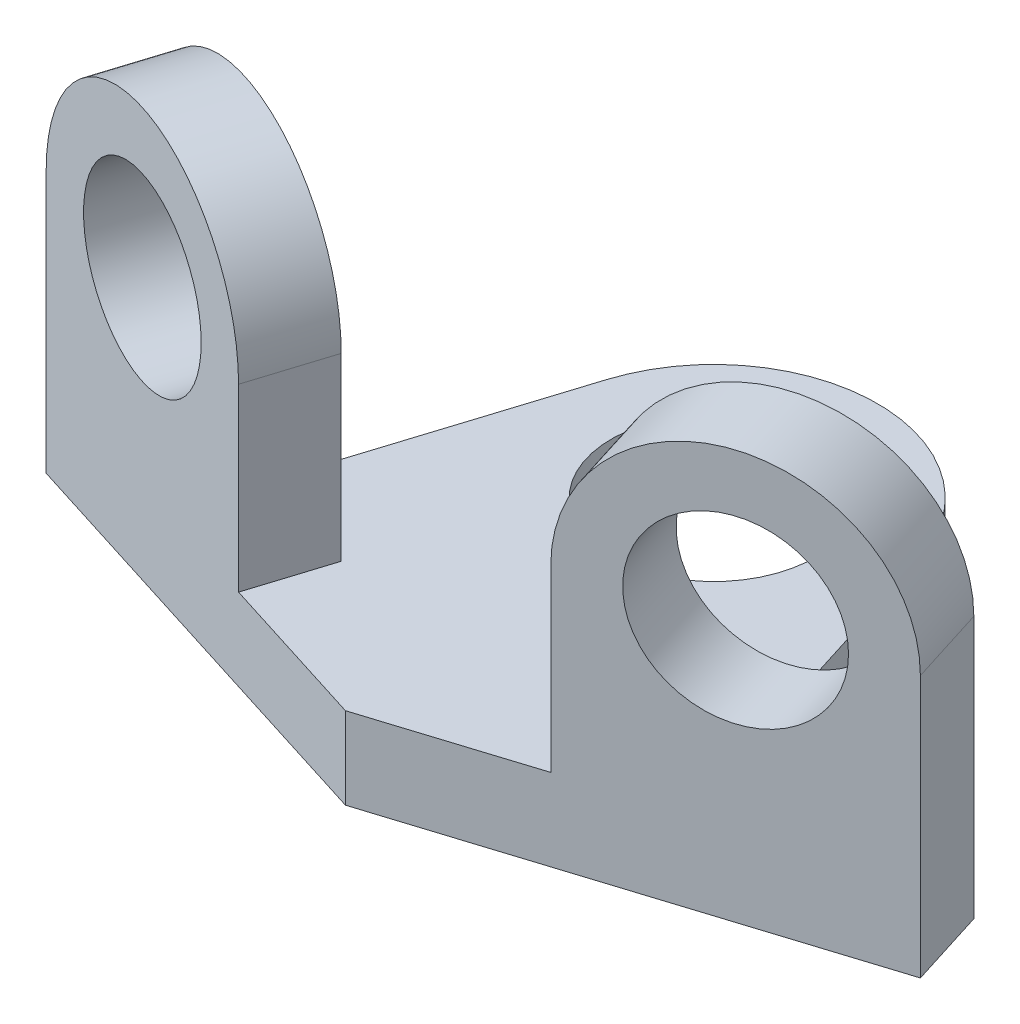
ISO-10303-21;
HEADER;
FILE_DESCRIPTION(('STEP AP214'),'2;1');
FILE_NAME('part.step','',(''),(''),'','','');
FILE_SCHEMA(('AUTOMOTIVE_DESIGN { 1 0 10303 214 1 1 1 1 }'));
ENDSEC;
DATA;
#1=APPLICATION_CONTEXT('core data for automotive mechanical design processes');
#2=APPLICATION_PROTOCOL_DEFINITION('international standard','automotive_design',2000,#1);
#3=PRODUCT_CONTEXT('',#1,'mechanical');
#4=PRODUCT('Part','Part','',(#3));
#5=PRODUCT_RELATED_PRODUCT_CATEGORY('part','',(#4));
#6=PRODUCT_DEFINITION_FORMATION('','',#4);
#7=PRODUCT_DEFINITION_CONTEXT('part definition',#1,'design');
#8=PRODUCT_DEFINITION('design','',#6,#7);
#9=PRODUCT_DEFINITION_SHAPE('','',#8);
#10=(LENGTH_UNIT() NAMED_UNIT(*) SI_UNIT(.MILLI.,.METRE.));
#11=(NAMED_UNIT(*) PLANE_ANGLE_UNIT() SI_UNIT($,.RADIAN.));
#12=(NAMED_UNIT(*) SI_UNIT($,.STERADIAN.) SOLID_ANGLE_UNIT());
#13=UNCERTAINTY_MEASURE_WITH_UNIT(LENGTH_MEASURE(1.E-05),#10,'distance_accuracy_value','');
#14=(GEOMETRIC_REPRESENTATION_CONTEXT(3) GLOBAL_UNCERTAINTY_ASSIGNED_CONTEXT((#13)) GLOBAL_UNIT_ASSIGNED_CONTEXT((#10,
#11,#12)) REPRESENTATION_CONTEXT('',''));
#15=CARTESIAN_POINT('',(0.,0.,0.));
#16=DIRECTION('',(0.,0.,1.));
#17=DIRECTION('',(1.,0.,0.));
#18=AXIS2_PLACEMENT_3D('',#15,#16,#17);
#19=CARTESIAN_POINT('',(0.,5.,-45.));
#20=DIRECTION('',(0.,1.,0.));
#21=DIRECTION('',(0.,0.,1.));
#22=AXIS2_PLACEMENT_3D('',#19,#20,#21);
#23=PLANE('',#22);
#24=DIRECTION('',(-0.953716950748228,0.,-0.30070579950427));
#25=VECTOR('',#24,1.);
#26=CARTESIAN_POINT('',(-9.89841182285572,5.,-13.6062485109799));
#27=LINE('',#26,#25);
#28=CARTESIAN_POINT('',(-16.0672810199219,5.,-15.5512854975677));
#29=VERTEX_POINT('',#28);
#30=CARTESIAN_POINT('',(-28.9727508378203,5.,-19.6203645010653));
#31=VERTEX_POINT('',#30);
#32=EDGE_CURVE('E63',#29,#31,#27,.T.);
#33=ORIENTED_EDGE('',*,*,#32,.F.);
#34=DIRECTION('',(-0.30070579950427,0.,0.953716950748228));
#35=VECTOR('',#34,1.);
#36=CARTESIAN_POINT('',(-6.16886919706614,5.,-46.9450369865878));
#37=LINE('',#36,#35);
#38=CARTESIAN_POINT('',(-19.0743390149646,5.,-6.0141159900854));
#39=VERTEX_POINT('',#38);
#40=EDGE_CURVE('E11',#29,#39,#37,.T.);
#41=ORIENTED_EDGE('',*,*,#40,.T.);
#42=DIRECTION('',(0.953716950748228,0.,0.30070579950427));
#43=VECTOR('',#42,1.);
#44=CARTESIAN_POINT('',(-31.979808832863,5.,-10.083194993583));
#45=LINE('',#44,#43);
#46=CARTESIAN_POINT('',(0.,5.,0.));
#47=VERTEX_POINT('',#46);
#48=EDGE_CURVE('E246',#39,#47,#45,.T.);
#49=ORIENTED_EDGE('',*,*,#48,.T.);
#50=DIRECTION('',(0.953716950748228,0.,-0.30070579950427));
#51=VECTOR('',#50,1.);
#52=CARTESIAN_POINT('',(0.,5.,0.));
#53=LINE('',#52,#51);
#54=CARTESIAN_POINT('',(19.0743390149646,5.,-6.0141159900854));
#55=VERTEX_POINT('',#54);
#56=EDGE_CURVE('E248',#47,#55,#53,.T.);
#57=ORIENTED_EDGE('',*,*,#56,.T.);
#58=DIRECTION('',(0.30070579950427,0.,0.953716950748228));
#59=VECTOR('',#58,1.);
#60=CARTESIAN_POINT('',(6.16886919706614,5.,-46.9450369865878));
#61=LINE('',#60,#59);
#62=CARTESIAN_POINT('',(16.0672810199219,5.,-15.5512854975677));
#63=VERTEX_POINT('',#62);
#64=EDGE_CURVE('E291',#63,#55,#61,.T.);
#65=ORIENTED_EDGE('',*,*,#64,.F.);
#66=DIRECTION('',(-0.953716950748228,0.,0.30070579950427));
#67=VECTOR('',#66,1.);
#68=CARTESIAN_POINT('',(9.89841182285572,5.,-13.6062485109799));
#69=LINE('',#68,#67);
#70=CARTESIAN_POINT('',(28.9727508378203,5.,-19.6203645010653));
#71=VERTEX_POINT('',#70);
#72=EDGE_CURVE('E227',#71,#63,#69,.T.);
#73=ORIENTED_EDGE('',*,*,#72,.F.);
#74=DIRECTION('',(-0.30070579950427,0.,-0.953716950748228));
#75=VECTOR('',#74,1.);
#76=CARTESIAN_POINT('',(31.979808832863,5.,-10.083194993583));
#77=LINE('',#76,#75);
#78=CARTESIAN_POINT('',(19.0743390149646,5.,-51.0141159900854));
#79=VERTEX_POINT('',#78);
#80=EDGE_CURVE('E255',#71,#79,#77,.T.);
#81=ORIENTED_EDGE('',*,*,#80,.T.);
#82=CARTESIAN_POINT('',(0.,5.,-45.));
#83=DIRECTION('',(0.,1.,0.));
#84=DIRECTION('',(0.,0.,1.));
#85=AXIS2_PLACEMENT_3D('',#82,#83,#84);
#86=CIRCLE('',#85,20.);
#87=CARTESIAN_POINT('',(-19.0743390149646,5.,-51.0141159900854));
#88=VERTEX_POINT('',#87);
#89=EDGE_CURVE('E260',#79,#88,#86,.T.);
#90=ORIENTED_EDGE('',*,*,#89,.T.);
#91=DIRECTION('',(-0.30070579950427,0.,0.953716950748228));
#92=VECTOR('',#91,1.);
#93=CARTESIAN_POINT('',(-19.0743390149646,5.,-51.0141159900854));
#94=LINE('',#93,#92);
#95=EDGE_CURVE('E257',#88,#31,#94,.T.);
#96=ORIENTED_EDGE('',*,*,#95,.T.);
#97=EDGE_LOOP('',(#33,#41,#49,#57,#65,#73,#81,#90,#96));
#98=FACE_BOUND('',#97,.T.);
#99=CARTESIAN_POINT('',(0.,5.,-45.));
#100=DIRECTION('',(0.,1.,0.));
#101=DIRECTION('',(0.,0.,1.));
#102=AXIS2_PLACEMENT_3D('',#99,#100,#101);
#103=CIRCLE('',#102,12.5);
#104=CARTESIAN_POINT('',(0.,5.,-32.5));
#105=VERTEX_POINT('',#104);
#106=EDGE_CURVE('E236',#105,#105,#103,.T.);
#107=ORIENTED_EDGE('',*,*,#106,.F.);
#108=EDGE_LOOP('',(#107));
#109=FACE_BOUND('',#108,.T.);
#110=ADVANCED_FACE('F44',(#98,#109),#23,.T.);
#111=CARTESIAN_POINT('',(0.,-5.,-45.));
#112=DIRECTION('',(0.,1.,0.));
#113=DIRECTION('',(0.,0.,1.));
#114=AXIS2_PLACEMENT_3D('',#111,#112,#113);
#115=PLANE('',#114);
#116=DIRECTION('',(0.953716950748228,0.,0.30070579950427));
#117=VECTOR('',#116,1.);
#118=CARTESIAN_POINT('',(-31.979808832863,-5.,-10.083194993583));
#119=LINE('',#118,#117);
#120=CARTESIAN_POINT('',(-53.4081492419008,-5.,-16.8395247722391));
#121=VERTEX_POINT('',#120);
#122=CARTESIAN_POINT('',(0.,-5.,0.));
#123=VERTEX_POINT('',#122);
#124=EDGE_CURVE('E244',#121,#123,#119,.T.);
#125=ORIENTED_EDGE('',*,*,#124,.F.);
#126=DIRECTION('',(-0.30070579950427,0.,0.953716950748228));
#127=VECTOR('',#126,1.);
#128=CARTESIAN_POINT('',(-50.4010912468581,-5.,-26.3766942797214));
#129=LINE('',#128,#127);
#130=CARTESIAN_POINT('',(-50.4010912468581,-5.,-26.3766942797214));
#131=VERTEX_POINT('',#130);
#132=EDGE_CURVE('E185',#131,#121,#129,.T.);
#133=ORIENTED_EDGE('',*,*,#132,.F.);
#134=DIRECTION('',(-0.953716950748228,0.,-0.30070579950427));
#135=VECTOR('',#134,1.);
#136=CARTESIAN_POINT('',(-50.4010912468581,-5.,-26.3766942797214));
#137=LINE('',#136,#135);
#138=CARTESIAN_POINT('',(-28.9727508378203,-5.,-19.6203645010653));
#139=VERTEX_POINT('',#138);
#140=EDGE_CURVE('E164',#139,#131,#137,.T.);
#141=ORIENTED_EDGE('',*,*,#140,.F.);
#142=DIRECTION('',(-0.30070579950427,0.,0.953716950748228));
#143=VECTOR('',#142,1.);
#144=CARTESIAN_POINT('',(-19.0743390149646,-5.,-51.0141159900854));
#145=LINE('',#144,#143);
#146=CARTESIAN_POINT('',(-19.0743390149646,-5.,-51.0141159900854));
#147=VERTEX_POINT('',#146);
#148=EDGE_CURVE('E250',#147,#139,#145,.T.);
#149=ORIENTED_EDGE('',*,*,#148,.F.);
#150=CARTESIAN_POINT('',(0.,-5.,-45.));
#151=DIRECTION('',(0.,1.,0.));
#152=DIRECTION('',(0.,0.,1.));
#153=AXIS2_PLACEMENT_3D('',#150,#151,#152);
#154=CIRCLE('',#153,20.);
#155=CARTESIAN_POINT('',(19.0743390149646,-5.,-51.0141159900854));
#156=VERTEX_POINT('',#155);
#157=EDGE_CURVE('E272',#156,#147,#154,.T.);
#158=ORIENTED_EDGE('',*,*,#157,.F.);
#159=DIRECTION('',(-0.30070579950427,0.,-0.953716950748228));
#160=VECTOR('',#159,1.);
#161=CARTESIAN_POINT('',(31.979808832863,-5.,-10.083194993583));
#162=LINE('',#161,#160);
#163=CARTESIAN_POINT('',(28.9727508378203,-5.,-19.6203645010653));
#164=VERTEX_POINT('',#163);
#165=EDGE_CURVE('E269',#164,#156,#162,.T.);
#166=ORIENTED_EDGE('',*,*,#165,.F.);
#167=DIRECTION('',(0.953716950748228,0.,-0.30070579950427));
#168=VECTOR('',#167,1.);
#169=CARTESIAN_POINT('',(50.4010912468581,-5.,-26.3766942797214));
#170=LINE('',#169,#168);
#171=CARTESIAN_POINT('',(50.4010912468581,-5.,-26.3766942797214));
#172=VERTEX_POINT('',#171);
#173=EDGE_CURVE('E68',#164,#172,#170,.T.);
#174=ORIENTED_EDGE('',*,*,#173,.T.);
#175=DIRECTION('',(0.30070579950427,0.,0.953716950748228));
#176=VECTOR('',#175,1.);
#177=CARTESIAN_POINT('',(50.4010912468581,-5.,-26.3766942797214));
#178=LINE('',#177,#176);
#179=CARTESIAN_POINT('',(53.4081492419008,-5.,-16.8395247722391));
#180=VERTEX_POINT('',#179);
#181=EDGE_CURVE('E212',#172,#180,#178,.T.);
#182=ORIENTED_EDGE('',*,*,#181,.T.);
#183=DIRECTION('',(0.953716950748228,0.,-0.30070579950427));
#184=VECTOR('',#183,1.);
#185=CARTESIAN_POINT('',(0.,-5.,0.));
#186=LINE('',#185,#184);
#187=EDGE_CURVE('E270',#123,#180,#186,.T.);
#188=ORIENTED_EDGE('',*,*,#187,.F.);
#189=EDGE_LOOP('',(#125,#133,#141,#149,#158,#166,#174,#182,#188));
#190=FACE_BOUND('',#189,.T.);
#191=CARTESIAN_POINT('',(0.,-5.,-45.));
#192=DIRECTION('',(0.,1.,0.));
#193=DIRECTION('',(0.,0.,1.));
#194=AXIS2_PLACEMENT_3D('',#191,#192,#193);
#195=CIRCLE('',#194,12.5);
#196=CARTESIAN_POINT('',(0.,-5.,-32.5));
#197=VERTEX_POINT('',#196);
#198=EDGE_CURVE('E240',#197,#197,#195,.T.);
#199=ORIENTED_EDGE('',*,*,#198,.T.);
#200=EDGE_LOOP('',(#199));
#201=FACE_BOUND('',#200,.T.);
#202=ADVANCED_FACE('F315',(#190,#201),#115,.F.);
#203=CARTESIAN_POINT('',(-31.979808832863,5.,-10.083194993583));
#204=DIRECTION('',(0.30070579950427,0.,-0.953716950748228));
#205=DIRECTION('',(-0.953716950748228,0.,-0.30070579950427));
#206=AXIS2_PLACEMENT_3D('',#203,#204,#205);
#207=PLANE('',#206);
#208=ORIENTED_EDGE('',*,*,#48,.F.);
#209=DIRECTION('',(0.,-1.,0.));
#210=VECTOR('',#209,1.);
#211=CARTESIAN_POINT('',(-19.0743390149646,-5.,-6.0141159900854));
#212=LINE('',#211,#210);
#213=CARTESIAN_POINT('',(-19.0743390149646,27.,-6.0141159900854));
#214=VERTEX_POINT('',#213);
#215=EDGE_CURVE('E175',#214,#39,#212,.T.);
#216=ORIENTED_EDGE('',*,*,#215,.F.);
#217=CARTESIAN_POINT('',(-36.2412441284327,27.,-11.4268203811623));
#218=DIRECTION('',(0.30070579950427,0.,-0.953716950748228));
#219=DIRECTION('',(0.953716950748228,0.,0.30070579950427));
#220=AXIS2_PLACEMENT_3D('',#217,#218,#219);
#221=CIRCLE('',#220,18.);
#222=CARTESIAN_POINT('',(-53.4081492419008,27.,-16.8395247722391));
#223=VERTEX_POINT('',#222);
#224=EDGE_CURVE('E160',#223,#214,#221,.T.);
#225=ORIENTED_EDGE('',*,*,#224,.F.);
#226=DIRECTION('',(0.,1.,0.));
#227=VECTOR('',#226,1.);
#228=CARTESIAN_POINT('',(-53.4081492419008,27.,-16.8395247722391));
#229=LINE('',#228,#227);
#230=EDGE_CURVE('E169',#121,#223,#229,.T.);
#231=ORIENTED_EDGE('',*,*,#230,.F.);
#232=ORIENTED_EDGE('',*,*,#124,.T.);
#233=DIRECTION('',(0.,-1.,0.));
#234=VECTOR('',#233,1.);
#235=CARTESIAN_POINT('',(0.,5.,0.));
#236=LINE('',#235,#234);
#237=EDGE_CURVE('E286',#47,#123,#236,.T.);
#238=ORIENTED_EDGE('',*,*,#237,.F.);
#239=EDGE_LOOP('',(#208,#216,#225,#231,#232,#238));
#240=FACE_BOUND('',#239,.T.);
#241=CARTESIAN_POINT('',(-36.2412441284327,27.,-11.4268203811623));
#242=DIRECTION('',(0.30070579950427,0.,-0.953716950748228));
#243=DIRECTION('',(-0.953716950748228,0.,-0.30070579950427));
#244=AXIS2_PLACEMENT_3D('',#241,#242,#243);
#245=CIRCLE('',#244,11.);
#246=CARTESIAN_POINT('',(-25.7503576702022,27.,-8.11905658661529));
#247=VERTEX_POINT('',#246);
#248=EDGE_CURVE('E511',#247,#247,#245,.T.);
#249=ORIENTED_EDGE('',*,*,#248,.T.);
#250=EDGE_LOOP('',(#249));
#251=FACE_BOUND('',#250,.T.);
#252=ADVANCED_FACE('F50',(#240,#251),#207,.F.);
#253=CARTESIAN_POINT('',(0.,5.,0.));
#254=DIRECTION('',(-0.30070579950427,0.,-0.953716950748228));
#255=DIRECTION('',(-0.953716950748228,0.,0.30070579950427));
#256=AXIS2_PLACEMENT_3D('',#253,#254,#255);
#257=PLANE('',#256);
#258=ORIENTED_EDGE('',*,*,#187,.T.);
#259=DIRECTION('',(0.,1.,0.));
#260=VECTOR('',#259,1.);
#261=CARTESIAN_POINT('',(53.4081492419008,27.,-16.8395247722391));
#262=LINE('',#261,#260);
#263=CARTESIAN_POINT('',(53.4081492419008,27.,-16.8395247722391));
#264=VERTEX_POINT('',#263);
#265=EDGE_CURVE('E195',#180,#264,#262,.T.);
#266=ORIENTED_EDGE('',*,*,#265,.T.);
#267=CARTESIAN_POINT('',(36.2412441284327,27.,-11.4268203811623));
#268=DIRECTION('',(0.30070579950427,0.,0.953716950748228));
#269=DIRECTION('',(-0.953716950748228,0.,0.30070579950427));
#270=AXIS2_PLACEMENT_3D('',#267,#268,#269);
#271=CIRCLE('',#270,18.);
#272=CARTESIAN_POINT('',(19.0743390149646,27.,-6.0141159900854));
#273=VERTEX_POINT('',#272);
#274=EDGE_CURVE('E217',#264,#273,#271,.T.);
#275=ORIENTED_EDGE('',*,*,#274,.T.);
#276=DIRECTION('',(0.,-1.,0.));
#277=VECTOR('',#276,1.);
#278=CARTESIAN_POINT('',(19.0743390149646,-5.,-6.0141159900854));
#279=LINE('',#278,#277);
#280=EDGE_CURVE('E205',#273,#55,#279,.T.);
#281=ORIENTED_EDGE('',*,*,#280,.T.);
#282=ORIENTED_EDGE('',*,*,#56,.F.);
#283=ORIENTED_EDGE('',*,*,#237,.T.);
#284=EDGE_LOOP('',(#258,#266,#275,#281,#282,#283));
#285=FACE_BOUND('',#284,.T.);
#286=CARTESIAN_POINT('',(36.2412441284327,27.,-11.4268203811623));
#287=DIRECTION('',(0.30070579950427,0.,0.953716950748228));
#288=DIRECTION('',(0.953716950748228,0.,-0.30070579950427));
#289=AXIS2_PLACEMENT_3D('',#286,#287,#288);
#290=CIRCLE('',#289,11.);
#291=CARTESIAN_POINT('',(46.7321305866632,27.,-14.7345841757092));
#292=VERTEX_POINT('',#291);
#293=EDGE_CURVE('E186',#292,#292,#290,.T.);
#294=ORIENTED_EDGE('',*,*,#293,.F.);
#295=EDGE_LOOP('',(#294));
#296=FACE_BOUND('',#295,.T.);
#297=ADVANCED_FACE('F326',(#285,#296),#257,.F.);
#298=CARTESIAN_POINT('',(31.979808832863,5.,-10.083194993583));
#299=DIRECTION('',(-0.953716950748228,0.,0.30070579950427));
#300=DIRECTION('',(0.30070579950427,0.,0.953716950748228));
#301=AXIS2_PLACEMENT_3D('',#298,#299,#300);
#302=PLANE('',#301);
#303=ORIENTED_EDGE('',*,*,#80,.F.);
#304=DIRECTION('',(0.,-1.,0.));
#305=VECTOR('',#304,1.);
#306=CARTESIAN_POINT('',(28.9727508378203,5.,-19.6203645010653));
#307=LINE('',#306,#305);
#308=EDGE_CURVE('E290',#71,#164,#307,.T.);
#309=ORIENTED_EDGE('',*,*,#308,.T.);
#310=ORIENTED_EDGE('',*,*,#165,.T.);
#311=DIRECTION('',(0.,-1.,0.));
#312=VECTOR('',#311,1.);
#313=CARTESIAN_POINT('',(19.0743390149646,5.,-51.0141159900854));
#314=LINE('',#313,#312);
#315=EDGE_CURVE('E284',#79,#156,#314,.T.);
#316=ORIENTED_EDGE('',*,*,#315,.F.);
#317=EDGE_LOOP('',(#303,#309,#310,#316));
#318=FACE_BOUND('',#317,.T.);
#319=ADVANCED_FACE('F342',(#318),#302,.F.);
#320=CARTESIAN_POINT('',(0.,5.,-45.));
#321=DIRECTION('',(0.,-1.,0.));
#322=DIRECTION('',(0.,0.,-1.));
#323=AXIS2_PLACEMENT_3D('',#320,#321,#322);
#324=CYLINDRICAL_SURFACE('',#323,20.);
#325=ORIENTED_EDGE('',*,*,#157,.T.);
#326=DIRECTION('',(0.,-1.,0.));
#327=VECTOR('',#326,1.);
#328=CARTESIAN_POINT('',(-19.0743390149646,5.,-51.0141159900854));
#329=LINE('',#328,#327);
#330=EDGE_CURVE('E262',#88,#147,#329,.T.);
#331=ORIENTED_EDGE('',*,*,#330,.F.);
#332=ORIENTED_EDGE('',*,*,#89,.F.);
#333=ORIENTED_EDGE('',*,*,#315,.T.);
#334=EDGE_LOOP('',(#325,#331,#332,#333));
#335=FACE_BOUND('',#334,.T.);
#336=ADVANCED_FACE('F310',(#335),#324,.T.);
#337=CARTESIAN_POINT('',(-19.0743390149646,5.,-51.0141159900854));
#338=DIRECTION('',(0.953716950748228,0.,0.30070579950427));
#339=DIRECTION('',(0.30070579950427,0.,-0.953716950748228));
#340=AXIS2_PLACEMENT_3D('',#337,#338,#339);
#341=PLANE('',#340);
#342=ORIENTED_EDGE('',*,*,#148,.T.);
#343=DIRECTION('',(0.,1.,0.));
#344=VECTOR('',#343,1.);
#345=CARTESIAN_POINT('',(-28.9727508378203,5.,-19.6203645010653));
#346=LINE('',#345,#344);
#347=EDGE_CURVE('E53',#139,#31,#346,.T.);
#348=ORIENTED_EDGE('',*,*,#347,.T.);
#349=ORIENTED_EDGE('',*,*,#95,.F.);
#350=ORIENTED_EDGE('',*,*,#330,.T.);
#351=EDGE_LOOP('',(#342,#348,#349,#350));
#352=FACE_BOUND('',#351,.T.);
#353=ADVANCED_FACE('F297',(#352),#341,.F.);
#354=CARTESIAN_POINT('',(0.,5.,-45.));
#355=DIRECTION('',(0.,-1.,0.));
#356=DIRECTION('',(0.,0.,-1.));
#357=AXIS2_PLACEMENT_3D('',#354,#355,#356);
#358=CYLINDRICAL_SURFACE('',#357,12.5);
#359=ORIENTED_EDGE('',*,*,#106,.T.);
#360=EDGE_LOOP('',(#359));
#361=FACE_BOUND('',#360,.T.);
#362=ORIENTED_EDGE('',*,*,#198,.F.);
#363=EDGE_LOOP('',(#362));
#364=FACE_BOUND('',#363,.T.);
#365=ADVANCED_FACE('F361',(#361,#364),#358,.F.);
#366=CARTESIAN_POINT('',(16.0672810199219,-5.,-15.5512854975677));
#367=DIRECTION('',(-0.953716950748228,0.,0.30070579950427));
#368=DIRECTION('',(0.30070579950427,0.,0.953716950748228));
#369=AXIS2_PLACEMENT_3D('',#366,#367,#368);
#370=PLANE('',#369);
#371=DIRECTION('',(0.,-1.,0.));
#372=VECTOR('',#371,1.);
#373=CARTESIAN_POINT('',(16.0672810199219,-5.,-15.5512854975677));
#374=LINE('',#373,#372);
#375=CARTESIAN_POINT('',(16.0672810199219,27.,-15.5512854975677));
#376=VERTEX_POINT('',#375);
#377=EDGE_CURVE('E209',#376,#63,#374,.T.);
#378=ORIENTED_EDGE('',*,*,#377,.T.);
#379=ORIENTED_EDGE('',*,*,#64,.T.);
#380=ORIENTED_EDGE('',*,*,#280,.F.);
#381=DIRECTION('',(0.30070579950427,0.,0.953716950748228));
#382=VECTOR('',#381,1.);
#383=CARTESIAN_POINT('',(16.0672810199219,27.,-15.5512854975677));
#384=LINE('',#383,#382);
#385=EDGE_CURVE('E223',#376,#273,#384,.T.);
#386=ORIENTED_EDGE('',*,*,#385,.F.);
#387=EDGE_LOOP('',(#378,#379,#380,#386));
#388=FACE_BOUND('',#387,.T.);
#389=ADVANCED_FACE('F336',(#388),#370,.T.);
#390=CARTESIAN_POINT('',(33.23418613339,27.,-20.9639898886445));
#391=DIRECTION('',(0.30070579950427,0.,0.953716950748228));
#392=DIRECTION('',(0.953716950748228,0.,-0.30070579950427));
#393=AXIS2_PLACEMENT_3D('',#390,#391,#392);
#394=CYLINDRICAL_SURFACE('',#393,18.);
#395=ORIENTED_EDGE('',*,*,#274,.F.);
#396=DIRECTION('',(0.30070579950427,0.,0.953716950748228));
#397=VECTOR('',#396,1.);
#398=CARTESIAN_POINT('',(50.4010912468581,27.,-26.3766942797214));
#399=LINE('',#398,#397);
#400=CARTESIAN_POINT('',(50.4010912468581,27.,-26.3766942797214));
#401=VERTEX_POINT('',#400);
#402=EDGE_CURVE('E230',#401,#264,#399,.T.);
#403=ORIENTED_EDGE('',*,*,#402,.F.);
#404=CARTESIAN_POINT('',(33.23418613339,27.,-20.9639898886445));
#405=DIRECTION('',(0.30070579950427,0.,0.953716950748228));
#406=DIRECTION('',(-0.953716950748228,0.,0.30070579950427));
#407=AXIS2_PLACEMENT_3D('',#404,#405,#406);
#408=CIRCLE('',#407,18.);
#409=EDGE_CURVE('E206',#401,#376,#408,.T.);
#410=ORIENTED_EDGE('',*,*,#409,.T.);
#411=ORIENTED_EDGE('',*,*,#385,.T.);
#412=EDGE_LOOP('',(#395,#403,#410,#411));
#413=FACE_BOUND('',#412,.T.);
#414=ADVANCED_FACE('F339',(#413),#394,.T.);
#415=CARTESIAN_POINT('',(50.4010912468581,27.,-26.3766942797214));
#416=DIRECTION('',(0.953716950748228,0.,-0.30070579950427));
#417=DIRECTION('',(-0.30070579950427,0.,-0.953716950748228));
#418=AXIS2_PLACEMENT_3D('',#415,#416,#417);
#419=PLANE('',#418);
#420=ORIENTED_EDGE('',*,*,#265,.F.);
#421=ORIENTED_EDGE('',*,*,#181,.F.);
#422=DIRECTION('',(0.,1.,0.));
#423=VECTOR('',#422,1.);
#424=CARTESIAN_POINT('',(50.4010912468581,27.,-26.3766942797214));
#425=LINE('',#424,#423);
#426=EDGE_CURVE('E203',#172,#401,#425,.T.);
#427=ORIENTED_EDGE('',*,*,#426,.T.);
#428=ORIENTED_EDGE('',*,*,#402,.T.);
#429=EDGE_LOOP('',(#420,#421,#427,#428));
#430=FACE_BOUND('',#429,.T.);
#431=ADVANCED_FACE('F331',(#430),#419,.T.);
#432=CARTESIAN_POINT('',(33.23418613339,27.,-20.9639898886445));
#433=DIRECTION('',(-0.30070579950427,0.,-0.953716950748228));
#434=DIRECTION('',(-0.953716950748228,0.,0.30070579950427));
#435=AXIS2_PLACEMENT_3D('',#432,#433,#434);
#436=PLANE('',#435);
#437=CARTESIAN_POINT('',(33.23418613339,27.,-20.9639898886445));
#438=DIRECTION('',(0.30070579950427,0.,0.953716950748228));
#439=DIRECTION('',(0.953716950748228,0.,-0.30070579950427));
#440=AXIS2_PLACEMENT_3D('',#437,#438,#439);
#441=CIRCLE('',#440,11.);
#442=CARTESIAN_POINT('',(43.7250725916205,27.,-24.2717536831915));
#443=VERTEX_POINT('',#442);
#444=EDGE_CURVE('E191',#443,#443,#441,.T.);
#445=ORIENTED_EDGE('',*,*,#444,.T.);
#446=EDGE_LOOP('',(#445));
#447=FACE_BOUND('',#446,.T.);
#448=ORIENTED_EDGE('',*,*,#308,.F.);
#449=ORIENTED_EDGE('',*,*,#72,.T.);
#450=ORIENTED_EDGE('',*,*,#377,.F.);
#451=ORIENTED_EDGE('',*,*,#409,.F.);
#452=ORIENTED_EDGE('',*,*,#426,.F.);
#453=ORIENTED_EDGE('',*,*,#173,.F.);
#454=EDGE_LOOP('',(#448,#449,#450,#451,#452,#453));
#455=FACE_BOUND('',#454,.T.);
#456=ADVANCED_FACE('F344',(#447,#455),#436,.T.);
#457=CARTESIAN_POINT('',(33.23418613339,27.,-20.9639898886445));
#458=DIRECTION('',(0.30070579950427,0.,0.953716950748228));
#459=DIRECTION('',(0.953716950748228,0.,-0.30070579950427));
#460=AXIS2_PLACEMENT_3D('',#457,#458,#459);
#461=CYLINDRICAL_SURFACE('',#460,11.);
#462=CARTESIAN_POINT('',(43.7250725916205,27.,-24.2717536831915));
#463=CARTESIAN_POINT('',(43.7563961124022,27.,-24.1724081674886));
#464=CARTESIAN_POINT('',(43.7877196331838,27.,-24.0730626517856));
#465=CARTESIAN_POINT('',(43.8503666747472,27.,-23.8743716203798));
#466=CARTESIAN_POINT('',(43.8816901955289,27.,-23.7750261046768));
#467=CARTESIAN_POINT('',(43.9443372370923,27.,-23.5763350732709));
#468=CARTESIAN_POINT('',(43.975660757874,27.,-23.476989557568));
#469=CARTESIAN_POINT('',(44.0383077994374,27.,-23.2782985261621));
#470=CARTESIAN_POINT('',(44.0696313202191,27.,-23.1789530104592));
#471=CARTESIAN_POINT('',(44.1322783617825,27.,-22.9802619790533));
#472=CARTESIAN_POINT('',(44.1636018825642,27.,-22.8809164633503));
#473=CARTESIAN_POINT('',(44.2262489241276,27.,-22.6822254319445));
#474=CARTESIAN_POINT('',(44.2575724449093,27.,-22.5828799162415));
#475=CARTESIAN_POINT('',(44.3202194864727,27.,-22.3841888848356));
#476=CARTESIAN_POINT('',(44.3515430072543,27.,-22.2848433691327));
#477=CARTESIAN_POINT('',(44.4141900488177,27.,-22.0861523377268));
#478=CARTESIAN_POINT('',(44.4455135695994,27.,-21.9868068220239));
#479=CARTESIAN_POINT('',(44.5081606111628,27.,-21.788115790618));
#480=CARTESIAN_POINT('',(44.5394841319445,27.,-21.6887702749151));
#481=CARTESIAN_POINT('',(44.6021311735079,27.,-21.4900792435092));
#482=CARTESIAN_POINT('',(44.6334546942896,27.,-21.3907337278062));
#483=CARTESIAN_POINT('',(44.696101735853,27.,-21.1920426964004));
#484=CARTESIAN_POINT('',(44.7274252566347,27.,-21.0926971806974));
#485=CARTESIAN_POINT('',(44.7900722981981,27.,-20.8940061492915));
#486=CARTESIAN_POINT('',(44.8213958189798,27.,-20.7946606335886));
#487=CARTESIAN_POINT('',(44.8840428605432,27.,-20.5959696021827));
#488=CARTESIAN_POINT('',(44.9153663813249,27.,-20.4966240864798));
#489=CARTESIAN_POINT('',(44.9780134228882,27.,-20.2979330550739));
#490=CARTESIAN_POINT('',(45.0093369436699,27.,-20.198587539371));
#491=CARTESIAN_POINT('',(45.0719839852333,27.,-19.9998965079651));
#492=CARTESIAN_POINT('',(45.103307506015,27.,-19.9005509922621));
#493=CARTESIAN_POINT('',(45.1659545475784,27.,-19.7018599608563));
#494=CARTESIAN_POINT('',(45.1972780683601,27.,-19.6025144451533));
#495=CARTESIAN_POINT('',(45.2599251099235,27.,-19.4038234137474));
#496=CARTESIAN_POINT('',(45.2912486307052,27.,-19.3044778980445));
#497=CARTESIAN_POINT('',(45.3538956722686,27.,-19.1057868666386));
#498=CARTESIAN_POINT('',(45.3852191930503,27.,-19.0064413509357));
#499=CARTESIAN_POINT('',(45.4478662346137,27.,-18.8077503195298));
#500=CARTESIAN_POINT('',(45.4791897553954,27.,-18.7084048038268));
#501=CARTESIAN_POINT('',(45.5418367969588,27.,-18.509713772421));
#502=CARTESIAN_POINT('',(45.5731603177404,27.,-18.410368256718));
#503=CARTESIAN_POINT('',(45.6358073593038,27.,-18.2116772253121));
#504=CARTESIAN_POINT('',(45.6671308800855,27.,-18.1123317096092));
#505=CARTESIAN_POINT('',(45.7297779216489,27.,-17.9136406782033));
#506=CARTESIAN_POINT('',(45.7611014424306,27.,-17.8142951625004));
#507=CARTESIAN_POINT('',(45.823748483994,27.,-17.6156041310945));
#508=CARTESIAN_POINT('',(45.8550720047757,27.,-17.5162586153916));
#509=CARTESIAN_POINT('',(45.9177190463391,27.,-17.3175675839857));
#510=CARTESIAN_POINT('',(45.9490425671208,27.,-17.2182220682827));
#511=CARTESIAN_POINT('',(46.0116896086842,27.,-17.0195310368769));
#512=CARTESIAN_POINT('',(46.0430131294659,27.,-16.9201855211739));
#513=CARTESIAN_POINT('',(46.1056601710293,27.,-16.721494489768));
#514=CARTESIAN_POINT('',(46.136983691811,27.,-16.6221489740651));
#515=CARTESIAN_POINT('',(46.1996307333743,27.,-16.4234579426592));
#516=CARTESIAN_POINT('',(46.230954254156,27.,-16.3241124269563));
#517=CARTESIAN_POINT('',(46.2936012957194,27.,-16.1254213955504));
#518=CARTESIAN_POINT('',(46.3249248165011,27.,-16.0260758798475));
#519=CARTESIAN_POINT('',(46.3875718580645,27.,-15.8273848484416));
#520=CARTESIAN_POINT('',(46.4188953788462,27.,-15.7280393327386));
#521=CARTESIAN_POINT('',(46.4815424204096,27.,-15.5293483013328));
#522=CARTESIAN_POINT('',(46.5128659411913,27.,-15.4300027856298));
#523=CARTESIAN_POINT('',(46.5755129827547,27.,-15.2313117542239));
#524=CARTESIAN_POINT('',(46.6068365035364,27.,-15.131966238521));
#525=CARTESIAN_POINT('',(46.6694835450998,27.,-14.9332752071151));
#526=CARTESIAN_POINT('',(46.7008070658815,27.,-14.8339296914122));
#527=CARTESIAN_POINT('',(46.7321305866632,27.,-14.7345841757092));
#528=B_SPLINE_CURVE_WITH_KNOTS('',3,(#462,#463,#464,#465,#466,#467,#468,#469,#470,#471,#472,
#473,#474,#475,#476,#477,#478,#479,#480,#481,#482,#483,#484,#485,#486,#487,#488,#489,#490,#491,
#492,#493,#494,#495,#496,#497,#498,#499,#500,#501,#502,#503,#504,#505,#506,#507,#508,#509,#510,
#511,#512,#513,#514,#515,#516,#517,#518,#519,#520,#521,#522,#523,#524,#525,#526,#527),
.UNSPECIFIED.,.F.,.F.,(4,2,2,2,2,2,2,2,2,2,2,2,2,2,2,2,2,2,2,2,2,2,2,2,2,2,2,2,2,2,2,2,4),(0.,
0.312499999999998,0.624999999999996,0.937499999999997,1.25,1.5625,1.875,2.1875,2.5,2.8125,3.125,
3.4375,3.75,4.0625,4.375,4.6875,5.,5.3125,5.625,5.9375,6.25,6.5625,6.875,7.1875,7.5,7.8125,
8.125,8.4375,8.75,9.0625,9.375,9.6875,10.),.UNSPECIFIED.);
#529=EDGE_CURVE('BSEAM345',#443,#292,#528,.T.);
#530=ORIENTED_EDGE('',*,*,#444,.F.);
#531=ORIENTED_EDGE('',*,*,#293,.T.);
#532=ORIENTED_EDGE('',*,*,#529,.T.);
#533=ORIENTED_EDGE('',*,*,#529,.F.);
#534=EDGE_LOOP('',(#530,#532,#531,#533));
#535=FACE_BOUND('',#534,.T.);
#536=ADVANCED_FACE('F345',(#535),#461,.F.);
#537=CARTESIAN_POINT('',(-33.23418613339,27.,-20.9639898886445));
#538=DIRECTION('',(0.30070579950427,0.,-0.953716950748228));
#539=DIRECTION('',(0.953716950748228,0.,0.30070579950427));
#540=AXIS2_PLACEMENT_3D('',#537,#538,#539);
#541=PLANE('',#540);
#542=DIRECTION('',(0.,-1.,0.));
#543=VECTOR('',#542,1.);
#544=CARTESIAN_POINT('',(-16.0672810199219,-5.,-15.5512854975677));
#545=LINE('',#544,#543);
#546=CARTESIAN_POINT('',(-16.0672810199219,27.,-15.5512854975677));
#547=VERTEX_POINT('',#546);
#548=EDGE_CURVE('E144',#547,#29,#545,.T.);
#549=ORIENTED_EDGE('',*,*,#548,.T.);
#550=ORIENTED_EDGE('',*,*,#32,.T.);
#551=ORIENTED_EDGE('',*,*,#347,.F.);
#552=ORIENTED_EDGE('',*,*,#140,.T.);
#553=DIRECTION('',(0.,1.,0.));
#554=VECTOR('',#553,1.);
#555=CARTESIAN_POINT('',(-50.4010912468581,27.,-26.3766942797214));
#556=LINE('',#555,#554);
#557=CARTESIAN_POINT('',(-50.4010912468581,27.,-26.3766942797214));
#558=VERTEX_POINT('',#557);
#559=EDGE_CURVE('E150',#131,#558,#556,.T.);
#560=ORIENTED_EDGE('',*,*,#559,.T.);
#561=CARTESIAN_POINT('',(-33.23418613339,27.,-20.9639898886445));
#562=DIRECTION('',(0.30070579950427,0.,-0.953716950748228));
#563=DIRECTION('',(0.953716950748228,0.,0.30070579950427));
#564=AXIS2_PLACEMENT_3D('',#561,#562,#563);
#565=CIRCLE('',#564,18.);
#566=EDGE_CURVE('E140',#558,#547,#565,.T.);
#567=ORIENTED_EDGE('',*,*,#566,.T.);
#568=EDGE_LOOP('',(#549,#550,#551,#552,#560,#567));
#569=FACE_BOUND('',#568,.T.);
#570=CARTESIAN_POINT('',(-33.23418613339,27.,-20.9639898886445));
#571=DIRECTION('',(0.30070579950427,0.,-0.953716950748228));
#572=DIRECTION('',(-0.953716950748228,0.,-0.30070579950427));
#573=AXIS2_PLACEMENT_3D('',#570,#571,#572);
#574=CIRCLE('',#573,11.);
#575=CARTESIAN_POINT('',(-22.7432996751595,27.,-17.6562260940976));
#576=VERTEX_POINT('',#575);
#577=EDGE_CURVE('E177',#576,#576,#574,.T.);
#578=ORIENTED_EDGE('',*,*,#577,.F.);
#579=EDGE_LOOP('',(#578));
#580=FACE_BOUND('',#579,.T.);
#581=ADVANCED_FACE('F142',(#569,#580),#541,.T.);
#582=CARTESIAN_POINT('',(-50.4010912468581,27.,-26.3766942797214));
#583=DIRECTION('',(0.953716950748228,0.,0.30070579950427));
#584=DIRECTION('',(0.30070579950427,0.,-0.953716950748228));
#585=AXIS2_PLACEMENT_3D('',#582,#583,#584);
#586=PLANE('',#585);
#587=ORIENTED_EDGE('',*,*,#230,.T.);
#588=DIRECTION('',(-0.30070579950427,0.,0.953716950748228));
#589=VECTOR('',#588,1.);
#590=CARTESIAN_POINT('',(-50.4010912468581,27.,-26.3766942797214));
#591=LINE('',#590,#589);
#592=EDGE_CURVE('E161',#558,#223,#591,.T.);
#593=ORIENTED_EDGE('',*,*,#592,.F.);
#594=ORIENTED_EDGE('',*,*,#559,.F.);
#595=ORIENTED_EDGE('',*,*,#132,.T.);
#596=EDGE_LOOP('',(#587,#593,#594,#595));
#597=FACE_BOUND('',#596,.T.);
#598=ADVANCED_FACE('F320',(#597),#586,.F.);
#599=CARTESIAN_POINT('',(-33.23418613339,27.,-20.9639898886445));
#600=DIRECTION('',(-0.30070579950427,0.,0.953716950748228));
#601=DIRECTION('',(0.953716950748228,0.,0.30070579950427));
#602=AXIS2_PLACEMENT_3D('',#599,#600,#601);
#603=CYLINDRICAL_SURFACE('',#602,18.);
#604=ORIENTED_EDGE('',*,*,#224,.T.);
#605=DIRECTION('',(-0.30070579950427,0.,0.953716950748228));
#606=VECTOR('',#605,1.);
#607=CARTESIAN_POINT('',(-16.0672810199219,27.,-15.5512854975677));
#608=LINE('',#607,#606);
#609=EDGE_CURVE('E152',#547,#214,#608,.T.);
#610=ORIENTED_EDGE('',*,*,#609,.F.);
#611=ORIENTED_EDGE('',*,*,#566,.F.);
#612=ORIENTED_EDGE('',*,*,#592,.T.);
#613=EDGE_LOOP('',(#604,#610,#611,#612));
#614=FACE_BOUND('',#613,.T.);
#615=ADVANCED_FACE('F154',(#614),#603,.T.);
#616=CARTESIAN_POINT('',(-16.0672810199219,-5.,-15.5512854975677));
#617=DIRECTION('',(-0.953716950748228,0.,-0.30070579950427));
#618=DIRECTION('',(-0.30070579950427,0.,0.953716950748228));
#619=AXIS2_PLACEMENT_3D('',#616,#617,#618);
#620=PLANE('',#619);
#621=ORIENTED_EDGE('',*,*,#40,.F.);
#622=ORIENTED_EDGE('',*,*,#548,.F.);
#623=ORIENTED_EDGE('',*,*,#609,.T.);
#624=ORIENTED_EDGE('',*,*,#215,.T.);
#625=EDGE_LOOP('',(#621,#622,#623,#624));
#626=FACE_BOUND('',#625,.T.);
#627=ADVANCED_FACE('F162',(#626),#620,.F.);
#628=CARTESIAN_POINT('',(-33.23418613339,27.,-20.9639898886445));
#629=DIRECTION('',(-0.30070579950427,0.,0.953716950748228));
#630=DIRECTION('',(0.953716950748228,0.,0.30070579950427));
#631=AXIS2_PLACEMENT_3D('',#628,#629,#630);
#632=CYLINDRICAL_SURFACE('',#631,11.);
#633=CARTESIAN_POINT('',(-22.7432996751595,27.,-17.6562260940976));
#634=CARTESIAN_POINT('',(-22.7746231959412,27.,-17.5568805783946));
#635=CARTESIAN_POINT('',(-22.8059467167228,27.,-17.4575350626917));
#636=CARTESIAN_POINT('',(-22.8685937582862,27.,-17.2588440312858));
#637=CARTESIAN_POINT('',(-22.8999172790679,27.,-17.1594985155829));
#638=CARTESIAN_POINT('',(-22.9625643206313,27.,-16.960807484177));
#639=CARTESIAN_POINT('',(-22.993887841413,27.,-16.861461968474));
#640=CARTESIAN_POINT('',(-23.0565348829764,27.,-16.6627709370682));
#641=CARTESIAN_POINT('',(-23.0878584037581,27.,-16.5634254213652));
#642=CARTESIAN_POINT('',(-23.1505054453215,27.,-16.3647343899593));
#643=CARTESIAN_POINT('',(-23.1818289661032,27.,-16.2653888742564));
#644=CARTESIAN_POINT('',(-23.2444760076666,27.,-16.0666978428505));
#645=CARTESIAN_POINT('',(-23.2757995284483,27.,-15.9673523271476));
#646=CARTESIAN_POINT('',(-23.3384465700117,27.,-15.7686612957417));
#647=CARTESIAN_POINT('',(-23.3697700907934,27.,-15.6693157800388));
#648=CARTESIAN_POINT('',(-23.4324171323567,27.,-15.4706247486329));
#649=CARTESIAN_POINT('',(-23.4637406531384,27.,-15.3712792329299));
#650=CARTESIAN_POINT('',(-23.5263876947018,27.,-15.1725882015241));
#651=CARTESIAN_POINT('',(-23.5577112154835,27.,-15.0732426858211));
#652=CARTESIAN_POINT('',(-23.6203582570469,27.,-14.8745516544152));
#653=CARTESIAN_POINT('',(-23.6516817778286,27.,-14.7752061387123));
#654=CARTESIAN_POINT('',(-23.714328819392,27.,-14.5765151073064));
#655=CARTESIAN_POINT('',(-23.7456523401737,27.,-14.4771695916035));
#656=CARTESIAN_POINT('',(-23.8082993817371,27.,-14.2784785601976));
#657=CARTESIAN_POINT('',(-23.8396229025188,27.,-14.1791330444947));
#658=CARTESIAN_POINT('',(-23.9022699440822,27.,-13.9804420130888));
#659=CARTESIAN_POINT('',(-23.9335934648639,27.,-13.8810964973858));
#660=CARTESIAN_POINT('',(-23.9962405064272,27.,-13.68240546598));
#661=CARTESIAN_POINT('',(-24.0275640272089,27.,-13.583059950277));
#662=CARTESIAN_POINT('',(-24.0902110687723,27.,-13.3843689188711));
#663=CARTESIAN_POINT('',(-24.121534589554,27.,-13.2850234031682));
#664=CARTESIAN_POINT('',(-24.1841816311174,27.,-13.0863323717623));
#665=CARTESIAN_POINT('',(-24.2155051518991,27.,-12.9869868560594));
#666=CARTESIAN_POINT('',(-24.2781521934625,27.,-12.7882958246535));
#667=CARTESIAN_POINT('',(-24.3094757142442,27.,-12.6889503089505));
#668=CARTESIAN_POINT('',(-24.3721227558076,27.,-12.4902592775447));
#669=CARTESIAN_POINT('',(-24.4034462765893,27.,-12.3909137618417));
#670=CARTESIAN_POINT('',(-24.4660933181527,27.,-12.1922227304358));
#671=CARTESIAN_POINT('',(-24.4974168389344,27.,-12.0928772147329));
#672=CARTESIAN_POINT('',(-24.5600638804978,27.,-11.894186183327));
#673=CARTESIAN_POINT('',(-24.5913874012795,27.,-11.7948406676241));
#674=CARTESIAN_POINT('',(-24.6540344428428,27.,-11.5961496362182));
#675=CARTESIAN_POINT('',(-24.6853579636245,27.,-11.4968041205153));
#676=CARTESIAN_POINT('',(-24.7480050051879,27.,-11.2981130891094));
#677=CARTESIAN_POINT('',(-24.7793285259696,27.,-11.1987675734064));
#678=CARTESIAN_POINT('',(-24.841975567533,27.,-11.0000765420006));
#679=CARTESIAN_POINT('',(-24.8732990883147,27.,-10.9007310262976));
#680=CARTESIAN_POINT('',(-24.9359461298781,27.,-10.7020399948917));
#681=CARTESIAN_POINT('',(-24.9672696506598,27.,-10.6026944791888));
#682=CARTESIAN_POINT('',(-25.0299166922232,27.,-10.4040034477829));
#683=CARTESIAN_POINT('',(-25.0612402130049,27.,-10.30465793208));
#684=CARTESIAN_POINT('',(-25.1238872545683,27.,-10.1059669006741));
#685=CARTESIAN_POINT('',(-25.15521077535,27.,-10.0066213849712));
#686=CARTESIAN_POINT('',(-25.2178578169133,27.,-9.80793035356528));
#687=CARTESIAN_POINT('',(-25.249181337695,27.,-9.70858483786234));
#688=CARTESIAN_POINT('',(-25.3118283792584,27.,-9.50989380645646));
#689=CARTESIAN_POINT('',(-25.3431519000401,27.,-9.41054829075352));
#690=CARTESIAN_POINT('',(-25.4057989416035,27.,-9.21185725934764));
#691=CARTESIAN_POINT('',(-25.4371224623852,27.,-9.11251174364469));
#692=CARTESIAN_POINT('',(-25.4997695039486,27.,-8.91382071223881));
#693=CARTESIAN_POINT('',(-25.5310930247303,27.,-8.81447519653588));
#694=CARTESIAN_POINT('',(-25.5937400662937,27.,-8.61578416512999));
#695=CARTESIAN_POINT('',(-25.6250635870754,27.,-8.51643864942705));
#696=CARTESIAN_POINT('',(-25.6877106286388,27.,-8.31774761802117));
#697=CARTESIAN_POINT('',(-25.7190341494205,27.,-8.21840210231823));
#698=CARTESIAN_POINT('',(-25.7503576702022,27.,-8.11905658661529));
#699=B_SPLINE_CURVE_WITH_KNOTS('',3,(#633,#634,#635,#636,#637,#638,#639,#640,#641,#642,#643,
#644,#645,#646,#647,#648,#649,#650,#651,#652,#653,#654,#655,#656,#657,#658,#659,#660,#661,#662,
#663,#664,#665,#666,#667,#668,#669,#670,#671,#672,#673,#674,#675,#676,#677,#678,#679,#680,#681,
#682,#683,#684,#685,#686,#687,#688,#689,#690,#691,#692,#693,#694,#695,#696,#697,#698),
.UNSPECIFIED.,.F.,.F.,(4,2,2,2,2,2,2,2,2,2,2,2,2,2,2,2,2,2,2,2,2,2,2,2,2,2,2,2,2,2,2,2,4),(0.,
0.312499999999998,0.624999999999997,0.937499999999998,1.25,1.5625,1.875,2.1875,2.5,2.8125,3.125,
3.4375,3.75,4.0625,4.375,4.6875,5.,5.3125,5.625,5.9375,6.25,6.5625,6.875,7.1875,7.5,7.8125,
8.125,8.4375,8.75,9.0625,9.375,9.6875,10.),.UNSPECIFIED.);
#700=EDGE_CURVE('BSEAM413',#576,#247,#699,.T.);
#701=ORIENTED_EDGE('',*,*,#577,.T.);
#702=ORIENTED_EDGE('',*,*,#248,.F.);
#703=ORIENTED_EDGE('',*,*,#700,.T.);
#704=ORIENTED_EDGE('',*,*,#700,.F.);
#705=EDGE_LOOP('',(#701,#703,#702,#704));
#706=FACE_BOUND('',#705,.T.);
#707=ADVANCED_FACE('F413',(#706),#632,.F.);
#708=CLOSED_SHELL('',(#110,#202,#252,#297,#319,#336,#353,#365,#389,#414,#431,#456,#536,#581,
#598,#615,#627,#707));
#709=MANIFOLD_SOLID_BREP('B2',#708);
#710=ADVANCED_BREP_SHAPE_REPRESENTATION('',(#18,#709),#14);
#711=SHAPE_DEFINITION_REPRESENTATION(#9,#710);
ENDSEC;
END-ISO-10303-21;
